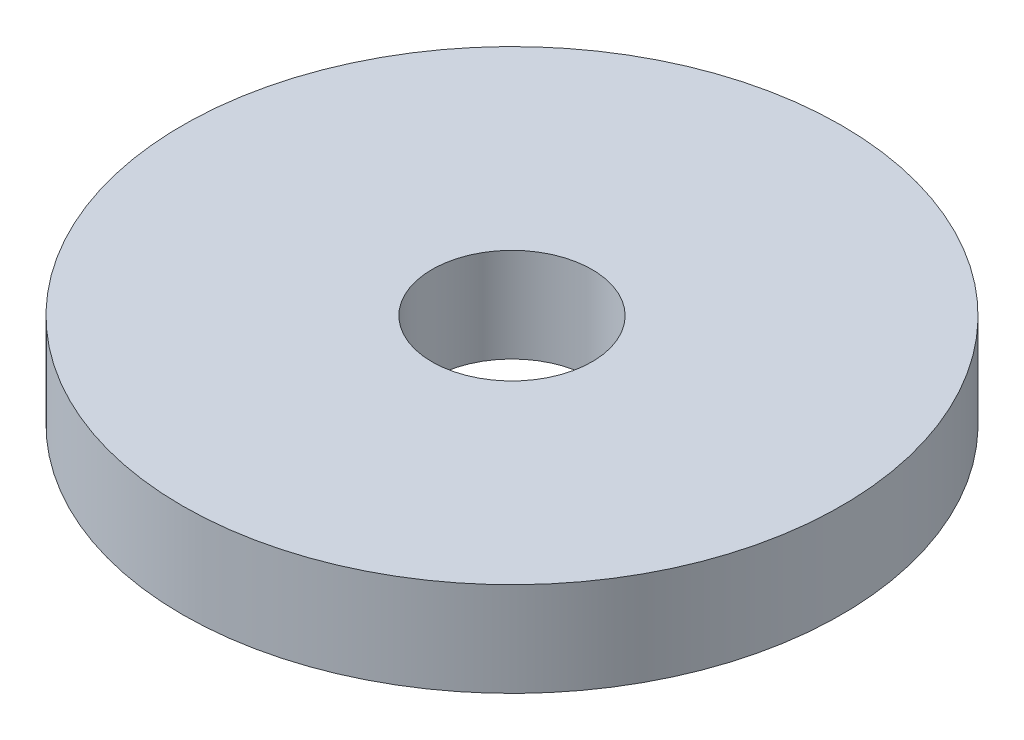
ISO-10303-21;
HEADER;
FILE_DESCRIPTION(('STEP AP214'),'2;1');
FILE_NAME('part.step','',(''),(''),'','','');
FILE_SCHEMA(('AUTOMOTIVE_DESIGN { 1 0 10303 214 1 1 1 1 }'));
ENDSEC;
DATA;
#1=APPLICATION_CONTEXT('core data for automotive mechanical design processes');
#2=APPLICATION_PROTOCOL_DEFINITION('international standard','automotive_design',2000,#1);
#3=PRODUCT_CONTEXT('',#1,'mechanical');
#4=PRODUCT('Part','Part','',(#3));
#5=PRODUCT_RELATED_PRODUCT_CATEGORY('part','',(#4));
#6=PRODUCT_DEFINITION_FORMATION('','',#4);
#7=PRODUCT_DEFINITION_CONTEXT('part definition',#1,'design');
#8=PRODUCT_DEFINITION('design','',#6,#7);
#9=PRODUCT_DEFINITION_SHAPE('','',#8);
#10=(LENGTH_UNIT() NAMED_UNIT(*) SI_UNIT(.MILLI.,.METRE.));
#11=(NAMED_UNIT(*) PLANE_ANGLE_UNIT() SI_UNIT($,.RADIAN.));
#12=(NAMED_UNIT(*) SI_UNIT($,.STERADIAN.) SOLID_ANGLE_UNIT());
#13=UNCERTAINTY_MEASURE_WITH_UNIT(LENGTH_MEASURE(1.E-05),#10,'distance_accuracy_value','');
#14=(GEOMETRIC_REPRESENTATION_CONTEXT(3) GLOBAL_UNCERTAINTY_ASSIGNED_CONTEXT((#13)) GLOBAL_UNIT_ASSIGNED_CONTEXT((#10,
#11,#12)) REPRESENTATION_CONTEXT('',''));
#15=CARTESIAN_POINT('',(0.,0.,0.));
#16=DIRECTION('',(0.,0.,1.));
#17=DIRECTION('',(1.,0.,0.));
#18=AXIS2_PLACEMENT_3D('',#15,#16,#17);
#19=CARTESIAN_POINT('',(7.0049,0.004899999999907,7.004903548781));
#20=DIRECTION('',(0.,1.,0.));
#21=DIRECTION('',(0.,0.,1.));
#22=AXIS2_PLACEMENT_3D('',#19,#20,#21);
#23=PLANE('',#22);
#24=CARTESIAN_POINT('',(7.0049,0.004900000000021,7.004903548781));
#25=DIRECTION('',(0.,1.,0.));
#26=DIRECTION('',(0.,0.,1.));
#27=AXIS2_PLACEMENT_3D('',#24,#25,#26);
#28=CIRCLE('',#27,1.7);
#29=CARTESIAN_POINT('',(7.0049,0.004900000000021,8.704903548781));
#30=VERTEX_POINT('',#29);
#31=EDGE_CURVE('E26',#30,#30,#28,.T.);
#32=ORIENTED_EDGE('',*,*,#31,.T.);
#33=EDGE_LOOP('',(#32));
#34=FACE_BOUND('',#33,.T.);
#35=CARTESIAN_POINT('',(7.0049,0.004900000000021,7.004903548781));
#36=DIRECTION('',(0.,1.,0.));
#37=DIRECTION('',(0.,0.,1.));
#38=AXIS2_PLACEMENT_3D('',#35,#36,#37);
#39=CIRCLE('',#38,7.);
#40=CARTESIAN_POINT('',(7.0049,0.004900000000021,14.004903548781));
#41=VERTEX_POINT('',#40);
#42=EDGE_CURVE('E17',#41,#41,#39,.T.);
#43=ORIENTED_EDGE('',*,*,#42,.F.);
#44=EDGE_LOOP('',(#43));
#45=FACE_BOUND('',#44,.T.);
#46=ADVANCED_FACE('F14',(#34,#45),#23,.F.);
#47=CARTESIAN_POINT('',(7.0049,0.004899999999907,7.004903548781));
#48=DIRECTION('',(0.,1.,0.));
#49=DIRECTION('',(0.,0.,1.));
#50=AXIS2_PLACEMENT_3D('',#47,#48,#49);
#51=CYLINDRICAL_SURFACE('',#50,7.);
#52=ORIENTED_EDGE('',*,*,#42,.T.);
#53=EDGE_LOOP('',(#52));
#54=FACE_BOUND('',#53,.T.);
#55=CARTESIAN_POINT('',(7.0049,2.0049,7.004903548781));
#56=DIRECTION('',(0.,1.,0.));
#57=DIRECTION('',(0.,0.,1.));
#58=AXIS2_PLACEMENT_3D('',#55,#56,#57);
#59=CIRCLE('',#58,7.);
#60=CARTESIAN_POINT('',(7.0049,2.0049,14.004903548781));
#61=VERTEX_POINT('',#60);
#62=EDGE_CURVE('E21',#61,#61,#59,.T.);
#63=ORIENTED_EDGE('',*,*,#62,.F.);
#64=EDGE_LOOP('',(#63));
#65=FACE_BOUND('',#64,.T.);
#66=ADVANCED_FACE('F34',(#54,#65),#51,.T.);
#67=CARTESIAN_POINT('',(7.0049,0.004899999999907,7.004903548781));
#68=DIRECTION('',(0.,1.,0.));
#69=DIRECTION('',(0.,0.,1.));
#70=AXIS2_PLACEMENT_3D('',#67,#68,#69);
#71=CYLINDRICAL_SURFACE('',#70,1.7);
#72=ORIENTED_EDGE('',*,*,#31,.F.);
#73=EDGE_LOOP('',(#72));
#74=FACE_BOUND('',#73,.T.);
#75=CARTESIAN_POINT('',(7.0049,2.0049,7.004903548781));
#76=DIRECTION('',(0.,1.,0.));
#77=DIRECTION('',(0.,0.,1.));
#78=AXIS2_PLACEMENT_3D('',#75,#76,#77);
#79=CIRCLE('',#78,1.7);
#80=CARTESIAN_POINT('',(7.0049,2.0049,8.704903548781));
#81=VERTEX_POINT('',#80);
#82=EDGE_CURVE('E10',#81,#81,#79,.F.);
#83=ORIENTED_EDGE('',*,*,#82,.F.);
#84=EDGE_LOOP('',(#83));
#85=FACE_BOUND('',#84,.T.);
#86=ADVANCED_FACE('F42',(#74,#85),#71,.F.);
#87=CARTESIAN_POINT('',(7.0049,2.0049,7.004903548781));
#88=DIRECTION('',(0.,1.,0.));
#89=DIRECTION('',(0.,0.,1.));
#90=AXIS2_PLACEMENT_3D('',#87,#88,#89);
#91=PLANE('',#90);
#92=ORIENTED_EDGE('',*,*,#82,.T.);
#93=EDGE_LOOP('',(#92));
#94=FACE_BOUND('',#93,.T.);
#95=ORIENTED_EDGE('',*,*,#62,.T.);
#96=EDGE_LOOP('',(#95));
#97=FACE_BOUND('',#96,.T.);
#98=ADVANCED_FACE('F43',(#94,#97),#91,.T.);
#99=CLOSED_SHELL('',(#46,#66,#86,#98));
#100=MANIFOLD_SOLID_BREP('B1',#99);
#101=ADVANCED_BREP_SHAPE_REPRESENTATION('',(#18,#100),#14);
#102=SHAPE_DEFINITION_REPRESENTATION(#9,#101);
ENDSEC;
END-ISO-10303-21;
